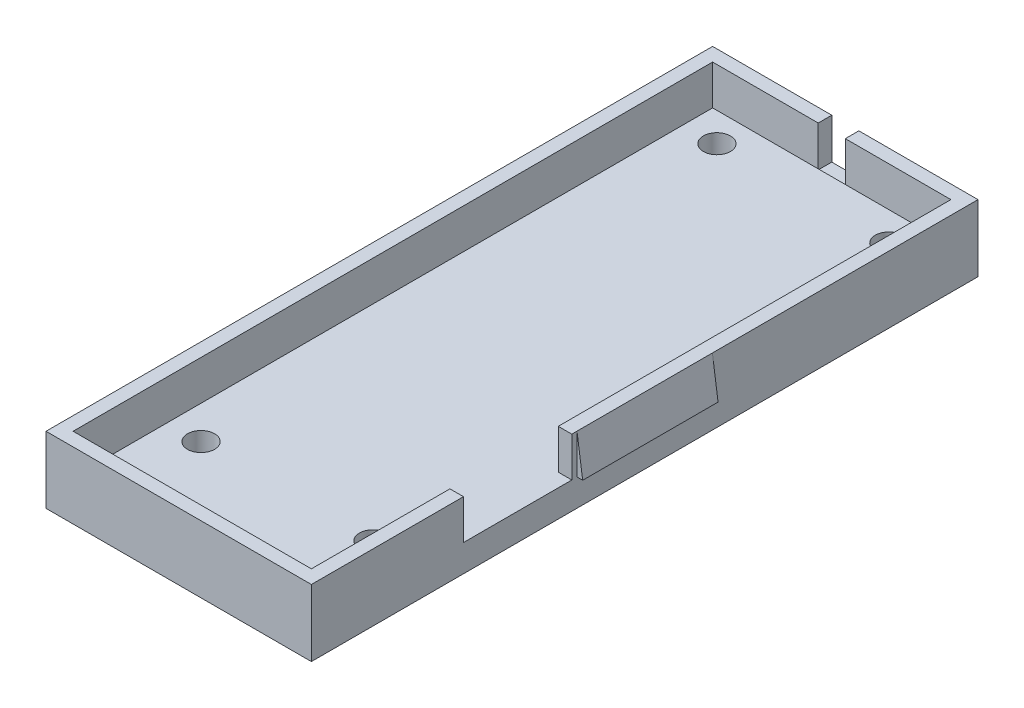
ISO-10303-21;
HEADER;
FILE_DESCRIPTION(('STEP AP214'),'2;1');
FILE_NAME('part.step','',(''),(''),'','','');
FILE_SCHEMA(('AUTOMOTIVE_DESIGN { 1 0 10303 214 1 1 1 1 }'));
ENDSEC;
DATA;
#1=APPLICATION_CONTEXT('core data for automotive mechanical design processes');
#2=APPLICATION_PROTOCOL_DEFINITION('international standard','automotive_design',2000,#1);
#3=PRODUCT_CONTEXT('',#1,'mechanical');
#4=PRODUCT('Part','Part','',(#3));
#5=PRODUCT_RELATED_PRODUCT_CATEGORY('part','',(#4));
#6=PRODUCT_DEFINITION_FORMATION('','',#4);
#7=PRODUCT_DEFINITION_CONTEXT('part definition',#1,'design');
#8=PRODUCT_DEFINITION('design','',#6,#7);
#9=PRODUCT_DEFINITION_SHAPE('','',#8);
#10=(LENGTH_UNIT() NAMED_UNIT(*) SI_UNIT(.MILLI.,.METRE.));
#11=(NAMED_UNIT(*) PLANE_ANGLE_UNIT() SI_UNIT($,.RADIAN.));
#12=(NAMED_UNIT(*) SI_UNIT($,.STERADIAN.) SOLID_ANGLE_UNIT());
#13=UNCERTAINTY_MEASURE_WITH_UNIT(LENGTH_MEASURE(1.E-05),#10,'distance_accuracy_value','');
#14=(GEOMETRIC_REPRESENTATION_CONTEXT(3) GLOBAL_UNCERTAINTY_ASSIGNED_CONTEXT((#13)) GLOBAL_UNIT_ASSIGNED_CONTEXT((#10,
#11,#12)) REPRESENTATION_CONTEXT('',''));
#15=CARTESIAN_POINT('',(0.,0.,0.));
#16=DIRECTION('',(0.,0.,1.));
#17=DIRECTION('',(1.,0.,0.));
#18=AXIS2_PLACEMENT_3D('',#15,#16,#17);
#19=CARTESIAN_POINT('',(14.7,-3.,0.));
#20=DIRECTION('',(1.,0.,0.));
#21=DIRECTION('',(0.,0.,-1.));
#22=AXIS2_PLACEMENT_3D('',#19,#20,#21);
#23=PLANE('',#22);
#24=DIRECTION('',(0.,0.,-1.));
#25=VECTOR('',#24,1.);
#26=CARTESIAN_POINT('',(14.7,4.4,0.));
#27=LINE('',#26,#25);
#28=CARTESIAN_POINT('',(14.7,4.4,-7.5));
#29=VERTEX_POINT('',#28);
#30=CARTESIAN_POINT('',(14.7,4.4,-36.925));
#31=VERTEX_POINT('',#30);
#32=EDGE_CURVE('E211',#29,#31,#27,.T.);
#33=ORIENTED_EDGE('',*,*,#32,.F.);
#34=DIRECTION('',(0.,-1.,0.));
#35=VECTOR('',#34,1.);
#36=CARTESIAN_POINT('',(14.7,4.4,-7.5));
#37=LINE('',#36,#35);
#38=CARTESIAN_POINT('',(14.7,0.,-7.5));
#39=VERTEX_POINT('',#38);
#40=EDGE_CURVE('E220',#29,#39,#37,.T.);
#41=ORIENTED_EDGE('',*,*,#40,.T.);
#42=DIRECTION('',(0.,0.,1.));
#43=VECTOR('',#42,1.);
#44=CARTESIAN_POINT('',(14.7,0.,-7.5));
#45=LINE('',#44,#43);
#46=CARTESIAN_POINT('',(14.7,0.,7.5));
#47=VERTEX_POINT('',#46);
#48=EDGE_CURVE('E667',#39,#47,#45,.T.);
#49=ORIENTED_EDGE('',*,*,#48,.T.);
#50=DIRECTION('',(0.,1.,0.));
#51=VECTOR('',#50,1.);
#52=CARTESIAN_POINT('',(14.7,4.4,7.5));
#53=LINE('',#52,#51);
#54=CARTESIAN_POINT('',(14.7,4.4,7.5));
#55=VERTEX_POINT('',#54);
#56=EDGE_CURVE('E227',#47,#55,#53,.T.);
#57=ORIENTED_EDGE('',*,*,#56,.T.);
#58=CARTESIAN_POINT('',(14.7,4.4,8.07500000000001));
#59=VERTEX_POINT('',#58);
#60=EDGE_CURVE('E215',#59,#55,#27,.T.);
#61=ORIENTED_EDGE('',*,*,#60,.F.);
#62=DIRECTION('',(0.,-1.,0.));
#63=VECTOR('',#62,1.);
#64=CARTESIAN_POINT('',(14.7,0.,8.07500000000001));
#65=LINE('',#64,#63);
#66=CARTESIAN_POINT('',(14.7,0.,8.07500000000001));
#67=VERTEX_POINT('',#66);
#68=EDGE_CURVE('E418',#59,#67,#65,.T.);
#69=ORIENTED_EDGE('',*,*,#68,.T.);
#70=DIRECTION('',(0.,0.,1.));
#71=VECTOR('',#70,1.);
#72=CARTESIAN_POINT('',(14.7,0.,8.07500000000001));
#73=LINE('',#72,#71);
#74=CARTESIAN_POINT('',(14.7,0.,20.075));
#75=VERTEX_POINT('',#74);
#76=EDGE_CURVE('E411',#67,#75,#73,.T.);
#77=ORIENTED_EDGE('',*,*,#76,.T.);
#78=DIRECTION('',(0.,1.,0.));
#79=VECTOR('',#78,1.);
#80=CARTESIAN_POINT('',(14.7,0.,20.075));
#81=LINE('',#80,#79);
#82=CARTESIAN_POINT('',(14.7,4.4,20.075));
#83=VERTEX_POINT('',#82);
#84=EDGE_CURVE('E424',#75,#83,#81,.T.);
#85=ORIENTED_EDGE('',*,*,#84,.T.);
#86=CARTESIAN_POINT('',(14.7,4.4,36.925));
#87=VERTEX_POINT('',#86);
#88=EDGE_CURVE('E235',#87,#83,#27,.T.);
#89=ORIENTED_EDGE('',*,*,#88,.F.);
#90=DIRECTION('',(0.,1.,0.));
#91=VECTOR('',#90,1.);
#92=CARTESIAN_POINT('',(14.7,-3.,36.925));
#93=LINE('',#92,#91);
#94=CARTESIAN_POINT('',(14.7,-3.,36.925));
#95=VERTEX_POINT('',#94);
#96=EDGE_CURVE('E329',#95,#87,#93,.T.);
#97=ORIENTED_EDGE('',*,*,#96,.F.);
#98=DIRECTION('',(0.,0.,-1.));
#99=VECTOR('',#98,1.);
#100=CARTESIAN_POINT('',(14.7,-3.,0.));
#101=LINE('',#100,#99);
#102=CARTESIAN_POINT('',(14.7,-3.,-36.925));
#103=VERTEX_POINT('',#102);
#104=EDGE_CURVE('E319',#95,#103,#101,.T.);
#105=ORIENTED_EDGE('',*,*,#104,.T.);
#106=DIRECTION('',(0.,1.,0.));
#107=VECTOR('',#106,1.);
#108=CARTESIAN_POINT('',(14.7,-3.,-36.925));
#109=LINE('',#108,#107);
#110=EDGE_CURVE('E230',#103,#31,#109,.T.);
#111=ORIENTED_EDGE('',*,*,#110,.T.);
#112=EDGE_LOOP('',(#33,#41,#49,#57,#61,#69,#77,#85,#89,#97,#105,#111));
#113=FACE_BOUND('',#112,.T.);
#114=ADVANCED_FACE('F47',(#113),#23,.T.);
#115=CARTESIAN_POINT('',(-14.7,-3.,0.));
#116=DIRECTION('',(1.,0.,0.));
#117=DIRECTION('',(0.,0.,-1.));
#118=AXIS2_PLACEMENT_3D('',#115,#116,#117);
#119=PLANE('',#118);
#120=DIRECTION('',(0.,-1.,0.));
#121=VECTOR('',#120,1.);
#122=CARTESIAN_POINT('',(-14.7,4.4,-7.5));
#123=LINE('',#122,#121);
#124=CARTESIAN_POINT('',(-14.7,4.4,-7.5));
#125=VERTEX_POINT('',#124);
#126=CARTESIAN_POINT('',(-14.7,0.,-7.5));
#127=VERTEX_POINT('',#126);
#128=EDGE_CURVE('E378',#125,#127,#123,.T.);
#129=ORIENTED_EDGE('',*,*,#128,.F.);
#130=DIRECTION('',(0.,0.,-1.));
#131=VECTOR('',#130,1.);
#132=CARTESIAN_POINT('',(-14.7,4.4,0.));
#133=LINE('',#132,#131);
#134=CARTESIAN_POINT('',(-14.7,4.4,-36.925));
#135=VERTEX_POINT('',#134);
#136=EDGE_CURVE('E257',#125,#135,#133,.T.);
#137=ORIENTED_EDGE('',*,*,#136,.T.);
#138=DIRECTION('',(0.,1.,0.));
#139=VECTOR('',#138,1.);
#140=CARTESIAN_POINT('',(-14.7,-3.,-36.925));
#141=LINE('',#140,#139);
#142=CARTESIAN_POINT('',(-14.7,-3.,-36.925));
#143=VERTEX_POINT('',#142);
#144=EDGE_CURVE('E334',#143,#135,#141,.T.);
#145=ORIENTED_EDGE('',*,*,#144,.F.);
#146=DIRECTION('',(0.,0.,-1.));
#147=VECTOR('',#146,1.);
#148=CARTESIAN_POINT('',(-14.7,-3.,0.));
#149=LINE('',#148,#147);
#150=CARTESIAN_POINT('',(-14.7,-3.,36.925));
#151=VERTEX_POINT('',#150);
#152=EDGE_CURVE('E326',#151,#143,#149,.T.);
#153=ORIENTED_EDGE('',*,*,#152,.F.);
#154=DIRECTION('',(0.,1.,0.));
#155=VECTOR('',#154,1.);
#156=CARTESIAN_POINT('',(-14.7,-3.,36.925));
#157=LINE('',#156,#155);
#158=CARTESIAN_POINT('',(-14.7,4.4,36.925));
#159=VERTEX_POINT('',#158);
#160=EDGE_CURVE('E330',#151,#159,#157,.T.);
#161=ORIENTED_EDGE('',*,*,#160,.T.);
#162=CARTESIAN_POINT('',(-14.7,4.4,7.5));
#163=VERTEX_POINT('',#162);
#164=EDGE_CURVE('E259',#159,#163,#133,.T.);
#165=ORIENTED_EDGE('',*,*,#164,.T.);
#166=DIRECTION('',(0.,1.,0.));
#167=VECTOR('',#166,1.);
#168=CARTESIAN_POINT('',(-14.7,4.4,7.5));
#169=LINE('',#168,#167);
#170=CARTESIAN_POINT('',(-14.7,0.,7.5));
#171=VERTEX_POINT('',#170);
#172=EDGE_CURVE('E392',#171,#163,#169,.T.);
#173=ORIENTED_EDGE('',*,*,#172,.F.);
#174=DIRECTION('',(0.,0.,1.));
#175=VECTOR('',#174,1.);
#176=CARTESIAN_POINT('',(-14.7,0.,-7.5));
#177=LINE('',#176,#175);
#178=EDGE_CURVE('E397',#127,#171,#177,.T.);
#179=ORIENTED_EDGE('',*,*,#178,.F.);
#180=EDGE_LOOP('',(#129,#137,#145,#153,#161,#165,#173,#179));
#181=FACE_BOUND('',#180,.T.);
#182=ADVANCED_FACE('F375',(#181),#119,.F.);
#183=CARTESIAN_POINT('',(13.2,4.4,0.));
#184=DIRECTION('',(-1.,0.,0.));
#185=DIRECTION('',(0.,0.,1.));
#186=AXIS2_PLACEMENT_3D('',#183,#184,#185);
#187=PLANE('',#186);
#188=DIRECTION('',(0.,1.,0.));
#189=VECTOR('',#188,1.);
#190=CARTESIAN_POINT('',(13.2,0.,20.075));
#191=LINE('',#190,#189);
#192=CARTESIAN_POINT('',(13.2,0.,20.075));
#193=VERTEX_POINT('',#192);
#194=CARTESIAN_POINT('',(13.2,4.4,20.075));
#195=VERTEX_POINT('',#194);
#196=EDGE_CURVE('E408',#193,#195,#191,.T.);
#197=ORIENTED_EDGE('',*,*,#196,.F.);
#198=DIRECTION('',(0.,0.,-1.));
#199=VECTOR('',#198,1.);
#200=CARTESIAN_POINT('',(13.2,0.,0.));
#201=LINE('',#200,#199);
#202=CARTESIAN_POINT('',(13.2,0.,35.425));
#203=VERTEX_POINT('',#202);
#204=EDGE_CURVE('E282',#203,#193,#201,.T.);
#205=ORIENTED_EDGE('',*,*,#204,.F.);
#206=DIRECTION('',(0.,-1.,0.));
#207=VECTOR('',#206,1.);
#208=CARTESIAN_POINT('',(13.2,4.4,35.425));
#209=LINE('',#208,#207);
#210=CARTESIAN_POINT('',(13.2,4.4,35.425));
#211=VERTEX_POINT('',#210);
#212=EDGE_CURVE('E311',#211,#203,#209,.T.);
#213=ORIENTED_EDGE('',*,*,#212,.F.);
#214=DIRECTION('',(0.,0.,-1.));
#215=VECTOR('',#214,1.);
#216=CARTESIAN_POINT('',(13.2,4.4,0.));
#217=LINE('',#216,#215);
#218=EDGE_CURVE('E264',#211,#195,#217,.T.);
#219=ORIENTED_EDGE('',*,*,#218,.T.);
#220=EDGE_LOOP('',(#197,#205,#213,#219));
#221=FACE_BOUND('',#220,.T.);
#222=ADVANCED_FACE('F518',(#221),#187,.T.);
#223=CARTESIAN_POINT('',(0.,4.4,0.));
#224=DIRECTION('',(0.,1.,0.));
#225=DIRECTION('',(0.,0.,1.));
#226=AXIS2_PLACEMENT_3D('',#223,#224,#225);
#227=PLANE('',#226);
#228=ORIENTED_EDGE('',*,*,#136,.F.);
#229=DIRECTION('',(0.,0.,1.));
#230=VECTOR('',#229,1.);
#231=CARTESIAN_POINT('',(-14.6999999999999,4.4,0.));
#232=LINE('',#231,#230);
#233=EDGE_CURVE('E363',#125,#163,#232,.T.);
#234=ORIENTED_EDGE('',*,*,#233,.T.);
#235=ORIENTED_EDGE('',*,*,#164,.F.);
#236=DIRECTION('',(-1.,0.,0.));
#237=VECTOR('',#236,1.);
#238=CARTESIAN_POINT('',(0.,4.4,36.925));
#239=LINE('',#238,#237);
#240=EDGE_CURVE('E233',#87,#159,#239,.T.);
#241=ORIENTED_EDGE('',*,*,#240,.F.);
#242=ORIENTED_EDGE('',*,*,#88,.T.);
#243=DIRECTION('',(-1.,0.,0.));
#244=VECTOR('',#243,1.);
#245=CARTESIAN_POINT('',(27.4812362469364,4.4,20.075));
#246=LINE('',#245,#244);
#247=EDGE_CURVE('E428',#83,#195,#246,.T.);
#248=ORIENTED_EDGE('',*,*,#247,.T.);
#249=ORIENTED_EDGE('',*,*,#218,.F.);
#250=DIRECTION('',(-1.,0.,0.));
#251=VECTOR('',#250,1.);
#252=CARTESIAN_POINT('',(0.,4.4,35.425));
#253=LINE('',#252,#251);
#254=CARTESIAN_POINT('',(-13.2,4.4,35.425));
#255=VERTEX_POINT('',#254);
#256=EDGE_CURVE('E268',#211,#255,#253,.T.);
#257=ORIENTED_EDGE('',*,*,#256,.T.);
#258=DIRECTION('',(0.,0.,-1.));
#259=VECTOR('',#258,1.);
#260=CARTESIAN_POINT('',(-13.2,4.4,0.));
#261=LINE('',#260,#259);
#262=CARTESIAN_POINT('',(-13.2,4.4,-35.425));
#263=VERTEX_POINT('',#262);
#264=EDGE_CURVE('E272',#255,#263,#261,.T.);
#265=ORIENTED_EDGE('',*,*,#264,.T.);
#266=DIRECTION('',(-1.,0.,0.));
#267=VECTOR('',#266,1.);
#268=CARTESIAN_POINT('',(0.,4.4,-35.425));
#269=LINE('',#268,#267);
#270=CARTESIAN_POINT('',(-1.5,4.4,-35.425));
#271=VERTEX_POINT('',#270);
#272=EDGE_CURVE('E276',#271,#263,#269,.T.);
#273=ORIENTED_EDGE('',*,*,#272,.F.);
#274=DIRECTION('',(0.,0.,-1.));
#275=VECTOR('',#274,1.);
#276=CARTESIAN_POINT('',(-1.5,4.4,-30.016673086804));
#277=LINE('',#276,#275);
#278=CARTESIAN_POINT('',(-1.5,4.4,-36.925));
#279=VERTEX_POINT('',#278);
#280=EDGE_CURVE('E463',#271,#279,#277,.T.);
#281=ORIENTED_EDGE('',*,*,#280,.T.);
#282=DIRECTION('',(-1.,0.,0.));
#283=VECTOR('',#282,1.);
#284=CARTESIAN_POINT('',(0.,4.4,-36.925));
#285=LINE('',#284,#283);
#286=EDGE_CURVE('E244',#279,#135,#285,.T.);
#287=ORIENTED_EDGE('',*,*,#286,.T.);
#288=EDGE_LOOP('',(#228,#234,#235,#241,#242,#248,#249,#257,#265,#273,#281,#287));
#289=FACE_BOUND('',#288,.T.);
#290=ADVANCED_FACE('F380',(#289),#227,.T.);
#291=CARTESIAN_POINT('',(0.,4.4,-35.425));
#292=DIRECTION('',(0.,0.,1.));
#293=DIRECTION('',(1.,0.,0.));
#294=AXIS2_PLACEMENT_3D('',#291,#292,#293);
#295=PLANE('',#294);
#296=DIRECTION('',(0.,1.,0.));
#297=VECTOR('',#296,1.);
#298=CARTESIAN_POINT('',(-1.5,4.4,-35.425));
#299=LINE('',#298,#297);
#300=CARTESIAN_POINT('',(-1.5,0.,-35.425));
#301=VERTEX_POINT('',#300);
#302=EDGE_CURVE('E464',#301,#271,#299,.T.);
#303=ORIENTED_EDGE('',*,*,#302,.T.);
#304=ORIENTED_EDGE('',*,*,#272,.T.);
#305=DIRECTION('',(0.,-1.,0.));
#306=VECTOR('',#305,1.);
#307=CARTESIAN_POINT('',(-13.2,4.4,-35.425));
#308=LINE('',#307,#306);
#309=CARTESIAN_POINT('',(-13.2,0.,-35.425));
#310=VERTEX_POINT('',#309);
#311=EDGE_CURVE('E303',#263,#310,#308,.T.);
#312=ORIENTED_EDGE('',*,*,#311,.T.);
#313=DIRECTION('',(-1.,0.,0.));
#314=VECTOR('',#313,1.);
#315=CARTESIAN_POINT('',(0.,0.,-35.425));
#316=LINE('',#315,#314);
#317=EDGE_CURVE('E295',#301,#310,#316,.T.);
#318=ORIENTED_EDGE('',*,*,#317,.F.);
#319=EDGE_LOOP('',(#303,#304,#312,#318));
#320=FACE_BOUND('',#319,.T.);
#321=ADVANCED_FACE('F525',(#320),#295,.T.);
#322=CARTESIAN_POINT('',(0.,-3.,36.925));
#323=DIRECTION('',(0.,0.,-1.));
#324=DIRECTION('',(-1.,0.,0.));
#325=AXIS2_PLACEMENT_3D('',#322,#323,#324);
#326=PLANE('',#325);
#327=ORIENTED_EDGE('',*,*,#96,.T.);
#328=ORIENTED_EDGE('',*,*,#240,.T.);
#329=ORIENTED_EDGE('',*,*,#160,.F.);
#330=DIRECTION('',(-1.,0.,0.));
#331=VECTOR('',#330,1.);
#332=CARTESIAN_POINT('',(0.,-3.,36.925));
#333=LINE('',#332,#331);
#334=EDGE_CURVE('E315',#95,#151,#333,.T.);
#335=ORIENTED_EDGE('',*,*,#334,.F.);
#336=EDGE_LOOP('',(#327,#328,#329,#335));
#337=FACE_BOUND('',#336,.T.);
#338=ADVANCED_FACE('F523',(#337),#326,.F.);
#339=CARTESIAN_POINT('',(0.,-3.,-36.925));
#340=DIRECTION('',(0.,0.,-1.));
#341=DIRECTION('',(-1.,0.,0.));
#342=AXIS2_PLACEMENT_3D('',#339,#340,#341);
#343=PLANE('',#342);
#344=DIRECTION('',(0.,1.,0.));
#345=VECTOR('',#344,1.);
#346=CARTESIAN_POINT('',(-1.5,4.4,-36.925));
#347=LINE('',#346,#345);
#348=CARTESIAN_POINT('',(-1.5,-0.0999999999999977,-36.925));
#349=VERTEX_POINT('',#348);
#350=EDGE_CURVE('E439',#349,#279,#347,.T.);
#351=ORIENTED_EDGE('',*,*,#350,.F.);
#352=DIRECTION('',(-1.,0.,0.));
#353=VECTOR('',#352,1.);
#354=CARTESIAN_POINT('',(-1.5,-0.0999999999999977,-36.925));
#355=LINE('',#354,#353);
#356=CARTESIAN_POINT('',(1.5,-0.0999999999999981,-36.925));
#357=VERTEX_POINT('',#356);
#358=EDGE_CURVE('E443',#357,#349,#355,.T.);
#359=ORIENTED_EDGE('',*,*,#358,.F.);
#360=DIRECTION('',(0.,-1.,0.));
#361=VECTOR('',#360,1.);
#362=CARTESIAN_POINT('',(1.5,4.4,-36.925));
#363=LINE('',#362,#361);
#364=CARTESIAN_POINT('',(1.5,4.4,-36.925));
#365=VERTEX_POINT('',#364);
#366=EDGE_CURVE('E438',#365,#357,#363,.T.);
#367=ORIENTED_EDGE('',*,*,#366,.F.);
#368=EDGE_CURVE('E251',#31,#365,#285,.T.);
#369=ORIENTED_EDGE('',*,*,#368,.F.);
#370=ORIENTED_EDGE('',*,*,#110,.F.);
#371=DIRECTION('',(-1.,0.,0.));
#372=VECTOR('',#371,1.);
#373=CARTESIAN_POINT('',(0.,-3.,-36.925));
#374=LINE('',#373,#372);
#375=EDGE_CURVE('E322',#103,#143,#374,.T.);
#376=ORIENTED_EDGE('',*,*,#375,.T.);
#377=ORIENTED_EDGE('',*,*,#144,.T.);
#378=ORIENTED_EDGE('',*,*,#286,.F.);
#379=EDGE_LOOP('',(#351,#359,#367,#369,#370,#376,#377,#378));
#380=FACE_BOUND('',#379,.T.);
#381=ADVANCED_FACE('F522',(#380),#343,.T.);
#382=CARTESIAN_POINT('',(0.,-3.,0.));
#383=DIRECTION('',(0.,1.,0.));
#384=DIRECTION('',(0.,0.,1.));
#385=AXIS2_PLACEMENT_3D('',#382,#383,#384);
#386=PLANE('',#385);
#387=CARTESIAN_POINT('',(9.52500000000001,-3.,24.925));
#388=DIRECTION('',(0.,1.,0.));
#389=DIRECTION('',(0.,0.,1.));
#390=AXIS2_PLACEMENT_3D('',#387,#388,#389);
#391=CIRCLE('',#390,1.5);
#392=CARTESIAN_POINT('',(9.52500000000001,-3.,26.425));
#393=VERTEX_POINT('',#392);
#394=EDGE_CURVE('E474',#393,#393,#391,.T.);
#395=ORIENTED_EDGE('',*,*,#394,.T.);
#396=EDGE_LOOP('',(#395));
#397=FACE_BOUND('',#396,.T.);
#398=CARTESIAN_POINT('',(-9.52499999999999,-3.,24.925));
#399=DIRECTION('',(0.,1.,0.));
#400=DIRECTION('',(0.,0.,1.));
#401=AXIS2_PLACEMENT_3D('',#398,#399,#400);
#402=CIRCLE('',#401,1.5);
#403=CARTESIAN_POINT('',(-9.52499999999999,-3.,26.425));
#404=VERTEX_POINT('',#403);
#405=EDGE_CURVE('E479',#404,#404,#402,.T.);
#406=ORIENTED_EDGE('',*,*,#405,.T.);
#407=EDGE_LOOP('',(#406));
#408=FACE_BOUND('',#407,.T.);
#409=CARTESIAN_POINT('',(-9.525,-3.,-32.225));
#410=DIRECTION('',(0.,1.,0.));
#411=DIRECTION('',(0.,0.,1.));
#412=AXIS2_PLACEMENT_3D('',#409,#410,#411);
#413=CIRCLE('',#412,1.5);
#414=CARTESIAN_POINT('',(-9.525,-3.,-30.725));
#415=VERTEX_POINT('',#414);
#416=EDGE_CURVE('E475',#415,#415,#413,.T.);
#417=ORIENTED_EDGE('',*,*,#416,.T.);
#418=EDGE_LOOP('',(#417));
#419=FACE_BOUND('',#418,.T.);
#420=CARTESIAN_POINT('',(9.525,-3.,-32.225));
#421=DIRECTION('',(0.,1.,0.));
#422=DIRECTION('',(0.,0.,1.));
#423=AXIS2_PLACEMENT_3D('',#420,#421,#422);
#424=CIRCLE('',#423,1.5);
#425=CARTESIAN_POINT('',(9.525,-3.,-30.725));
#426=VERTEX_POINT('',#425);
#427=EDGE_CURVE('E346',#426,#426,#424,.T.);
#428=ORIENTED_EDGE('',*,*,#427,.T.);
#429=EDGE_LOOP('',(#428));
#430=FACE_BOUND('',#429,.T.);
#431=ORIENTED_EDGE('',*,*,#334,.T.);
#432=ORIENTED_EDGE('',*,*,#152,.T.);
#433=ORIENTED_EDGE('',*,*,#375,.F.);
#434=ORIENTED_EDGE('',*,*,#104,.F.);
#435=EDGE_LOOP('',(#431,#432,#433,#434));
#436=FACE_BOUND('',#435,.T.);
#437=ADVANCED_FACE('F490',(#397,#408,#419,#430,#436),#386,.F.);
#438=DIRECTION('',(0.,-1.,0.));
#439=VECTOR('',#438,1.);
#440=CARTESIAN_POINT('',(13.2,0.,8.07500000000001));
#441=LINE('',#440,#439);
#442=CARTESIAN_POINT('',(13.2,4.4,8.07500000000001));
#443=VERTEX_POINT('',#442);
#444=CARTESIAN_POINT('',(13.2,0.,8.07500000000001));
#445=VERTEX_POINT('',#444);
#446=EDGE_CURVE('E403',#443,#445,#441,.T.);
#447=ORIENTED_EDGE('',*,*,#446,.F.);
#448=CARTESIAN_POINT('',(13.2,4.4,-35.425));
#449=VERTEX_POINT('',#448);
#450=EDGE_CURVE('E263',#443,#449,#217,.T.);
#451=ORIENTED_EDGE('',*,*,#450,.T.);
#452=DIRECTION('',(0.,-1.,0.));
#453=VECTOR('',#452,1.);
#454=CARTESIAN_POINT('',(13.2,4.4,-35.425));
#455=LINE('',#454,#453);
#456=CARTESIAN_POINT('',(13.2,0.,-35.425));
#457=VERTEX_POINT('',#456);
#458=EDGE_CURVE('E281',#449,#457,#455,.T.);
#459=ORIENTED_EDGE('',*,*,#458,.T.);
#460=EDGE_CURVE('E287',#445,#457,#201,.T.);
#461=ORIENTED_EDGE('',*,*,#460,.F.);
#462=EDGE_LOOP('',(#447,#451,#459,#461));
#463=FACE_BOUND('',#462,.T.);
#464=ADVANCED_FACE('F586',(#463),#187,.T.);
#465=CARTESIAN_POINT('',(0.,4.4,35.425));
#466=DIRECTION('',(0.,0.,1.));
#467=DIRECTION('',(1.,0.,0.));
#468=AXIS2_PLACEMENT_3D('',#465,#466,#467);
#469=PLANE('',#468);
#470=DIRECTION('',(-1.,0.,0.));
#471=VECTOR('',#470,1.);
#472=CARTESIAN_POINT('',(0.,0.,35.425));
#473=LINE('',#472,#471);
#474=CARTESIAN_POINT('',(-13.2,0.,35.425));
#475=VERTEX_POINT('',#474);
#476=EDGE_CURVE('E286',#203,#475,#473,.T.);
#477=ORIENTED_EDGE('',*,*,#476,.T.);
#478=DIRECTION('',(0.,-1.,0.));
#479=VECTOR('',#478,1.);
#480=CARTESIAN_POINT('',(-13.2,4.4,35.425));
#481=LINE('',#480,#479);
#482=EDGE_CURVE('E307',#255,#475,#481,.T.);
#483=ORIENTED_EDGE('',*,*,#482,.F.);
#484=ORIENTED_EDGE('',*,*,#256,.F.);
#485=ORIENTED_EDGE('',*,*,#212,.T.);
#486=EDGE_LOOP('',(#477,#483,#484,#485));
#487=FACE_BOUND('',#486,.T.);
#488=ADVANCED_FACE('F598',(#487),#469,.F.);
#489=CARTESIAN_POINT('',(-13.2,4.4,0.));
#490=DIRECTION('',(-1.,0.,0.));
#491=DIRECTION('',(0.,0.,1.));
#492=AXIS2_PLACEMENT_3D('',#489,#490,#491);
#493=PLANE('',#492);
#494=DIRECTION('',(0.,0.,-1.));
#495=VECTOR('',#494,1.);
#496=CARTESIAN_POINT('',(-13.2,0.,0.));
#497=LINE('',#496,#495);
#498=EDGE_CURVE('E291',#475,#310,#497,.T.);
#499=ORIENTED_EDGE('',*,*,#498,.T.);
#500=ORIENTED_EDGE('',*,*,#311,.F.);
#501=ORIENTED_EDGE('',*,*,#264,.F.);
#502=ORIENTED_EDGE('',*,*,#482,.T.);
#503=EDGE_LOOP('',(#499,#500,#501,#502));
#504=FACE_BOUND('',#503,.T.);
#505=ADVANCED_FACE('F606',(#504),#493,.F.);
#506=DIRECTION('',(0.,-1.,0.));
#507=VECTOR('',#506,1.);
#508=CARTESIAN_POINT('',(1.5,4.4,-35.425));
#509=LINE('',#508,#507);
#510=CARTESIAN_POINT('',(1.5,4.4,-35.425));
#511=VERTEX_POINT('',#510);
#512=CARTESIAN_POINT('',(1.5,0.,-35.425));
#513=VERTEX_POINT('',#512);
#514=EDGE_CURVE('E454',#511,#513,#509,.T.);
#515=ORIENTED_EDGE('',*,*,#514,.T.);
#516=EDGE_CURVE('E239',#457,#513,#316,.T.);
#517=ORIENTED_EDGE('',*,*,#516,.F.);
#518=ORIENTED_EDGE('',*,*,#458,.F.);
#519=EDGE_CURVE('E277',#449,#511,#269,.T.);
#520=ORIENTED_EDGE('',*,*,#519,.T.);
#521=EDGE_LOOP('',(#515,#517,#518,#520));
#522=FACE_BOUND('',#521,.T.);
#523=ADVANCED_FACE('F610',(#522),#295,.T.);
#524=ORIENTED_EDGE('',*,*,#60,.T.);
#525=DIRECTION('',(0.,0.,-1.));
#526=VECTOR('',#525,1.);
#527=CARTESIAN_POINT('',(14.6999999999999,4.4,0.));
#528=LINE('',#527,#526);
#529=EDGE_CURVE('E203',#55,#29,#528,.T.);
#530=ORIENTED_EDGE('',*,*,#529,.T.);
#531=ORIENTED_EDGE('',*,*,#32,.T.);
#532=ORIENTED_EDGE('',*,*,#368,.T.);
#533=DIRECTION('',(0.,0.,-1.));
#534=VECTOR('',#533,1.);
#535=CARTESIAN_POINT('',(1.5,4.4,-30.016673086804));
#536=LINE('',#535,#534);
#537=EDGE_CURVE('E465',#511,#365,#536,.T.);
#538=ORIENTED_EDGE('',*,*,#537,.F.);
#539=ORIENTED_EDGE('',*,*,#519,.F.);
#540=ORIENTED_EDGE('',*,*,#450,.F.);
#541=DIRECTION('',(-1.,0.,0.));
#542=VECTOR('',#541,1.);
#543=CARTESIAN_POINT('',(27.4812362469364,4.4,8.07500000000001));
#544=LINE('',#543,#542);
#545=EDGE_CURVE('E423',#59,#443,#544,.T.);
#546=ORIENTED_EDGE('',*,*,#545,.F.);
#547=EDGE_LOOP('',(#524,#530,#531,#532,#538,#539,#540,#546));
#548=FACE_BOUND('',#547,.T.);
#549=ADVANCED_FACE('F208',(#548),#227,.T.);
#550=CARTESIAN_POINT('',(0.,0.,0.));
#551=DIRECTION('',(0.,1.,0.));
#552=DIRECTION('',(0.,0.,1.));
#553=AXIS2_PLACEMENT_3D('',#550,#551,#552);
#554=PLANE('',#553);
#555=CARTESIAN_POINT('',(9.52500000000001,0.,24.925));
#556=DIRECTION('',(0.,1.,0.));
#557=DIRECTION('',(0.,0.,1.));
#558=AXIS2_PLACEMENT_3D('',#555,#556,#557);
#559=CIRCLE('',#558,1.5);
#560=CARTESIAN_POINT('',(9.52500000000001,0.,26.425));
#561=VERTEX_POINT('',#560);
#562=EDGE_CURVE('E354',#561,#561,#559,.T.);
#563=ORIENTED_EDGE('',*,*,#562,.F.);
#564=EDGE_LOOP('',(#563));
#565=FACE_BOUND('',#564,.T.);
#566=CARTESIAN_POINT('',(-9.52499999999999,0.,24.925));
#567=DIRECTION('',(0.,1.,0.));
#568=DIRECTION('',(0.,0.,1.));
#569=AXIS2_PLACEMENT_3D('',#566,#567,#568);
#570=CIRCLE('',#569,1.5);
#571=CARTESIAN_POINT('',(-9.52499999999999,0.,26.425));
#572=VERTEX_POINT('',#571);
#573=EDGE_CURVE('E350',#572,#572,#570,.T.);
#574=ORIENTED_EDGE('',*,*,#573,.F.);
#575=EDGE_LOOP('',(#574));
#576=FACE_BOUND('',#575,.T.);
#577=CARTESIAN_POINT('',(-9.525,0.,-32.225));
#578=DIRECTION('',(0.,1.,0.));
#579=DIRECTION('',(0.,0.,1.));
#580=AXIS2_PLACEMENT_3D('',#577,#578,#579);
#581=CIRCLE('',#580,1.5);
#582=CARTESIAN_POINT('',(-9.525,0.,-30.725));
#583=VERTEX_POINT('',#582);
#584=EDGE_CURVE('E345',#583,#583,#581,.T.);
#585=ORIENTED_EDGE('',*,*,#584,.F.);
#586=EDGE_LOOP('',(#585));
#587=FACE_BOUND('',#586,.T.);
#588=CARTESIAN_POINT('',(9.525,0.,-32.225));
#589=DIRECTION('',(0.,1.,0.));
#590=DIRECTION('',(0.,0.,1.));
#591=AXIS2_PLACEMENT_3D('',#588,#589,#590);
#592=CIRCLE('',#591,1.5);
#593=CARTESIAN_POINT('',(9.525,0.,-30.725));
#594=VERTEX_POINT('',#593);
#595=EDGE_CURVE('E341',#594,#594,#592,.T.);
#596=ORIENTED_EDGE('',*,*,#595,.F.);
#597=EDGE_LOOP('',(#596));
#598=FACE_BOUND('',#597,.T.);
#599=ORIENTED_EDGE('',*,*,#204,.T.);
#600=DIRECTION('',(-1.,0.,0.));
#601=VECTOR('',#600,1.);
#602=CARTESIAN_POINT('',(27.4812362469364,0.,20.075));
#603=LINE('',#602,#601);
#604=EDGE_CURVE('E417',#75,#193,#603,.T.);
#605=ORIENTED_EDGE('',*,*,#604,.F.);
#606=ORIENTED_EDGE('',*,*,#76,.F.);
#607=DIRECTION('',(-1.,0.,0.));
#608=VECTOR('',#607,1.);
#609=CARTESIAN_POINT('',(27.4812362469364,0.,8.07500000000001));
#610=LINE('',#609,#608);
#611=EDGE_CURVE('E422',#67,#445,#610,.T.);
#612=ORIENTED_EDGE('',*,*,#611,.T.);
#613=ORIENTED_EDGE('',*,*,#460,.T.);
#614=ORIENTED_EDGE('',*,*,#516,.T.);
#615=EDGE_CURVE('E299',#513,#301,#316,.T.);
#616=ORIENTED_EDGE('',*,*,#615,.T.);
#617=ORIENTED_EDGE('',*,*,#317,.T.);
#618=ORIENTED_EDGE('',*,*,#498,.F.);
#619=ORIENTED_EDGE('',*,*,#476,.F.);
#620=EDGE_LOOP('',(#599,#605,#606,#612,#613,#614,#616,#617,#618,#619));
#621=FACE_BOUND('',#620,.T.);
#622=ADVANCED_FACE('F496',(#565,#576,#587,#598,#621),#554,.T.);
#623=CARTESIAN_POINT('',(9.525,-3.,-32.225));
#624=DIRECTION('',(0.,1.,0.));
#625=DIRECTION('',(0.,0.,1.));
#626=AXIS2_PLACEMENT_3D('',#623,#624,#625);
#627=CYLINDRICAL_SURFACE('',#626,1.5);
#628=ORIENTED_EDGE('',*,*,#595,.T.);
#629=EDGE_LOOP('',(#628));
#630=FACE_BOUND('',#629,.T.);
#631=ORIENTED_EDGE('',*,*,#427,.F.);
#632=EDGE_LOOP('',(#631));
#633=FACE_BOUND('',#632,.T.);
#634=ADVANCED_FACE('F493',(#630,#633),#627,.F.);
#635=CARTESIAN_POINT('',(-9.525,-3.,-32.225));
#636=DIRECTION('',(0.,1.,0.));
#637=DIRECTION('',(0.,0.,1.));
#638=AXIS2_PLACEMENT_3D('',#635,#636,#637);
#639=CYLINDRICAL_SURFACE('',#638,1.5);
#640=ORIENTED_EDGE('',*,*,#584,.T.);
#641=EDGE_LOOP('',(#640));
#642=FACE_BOUND('',#641,.T.);
#643=ORIENTED_EDGE('',*,*,#416,.F.);
#644=EDGE_LOOP('',(#643));
#645=FACE_BOUND('',#644,.T.);
#646=ADVANCED_FACE('F495',(#642,#645),#639,.F.);
#647=CARTESIAN_POINT('',(-9.52499999999999,-3.,24.925));
#648=DIRECTION('',(0.,1.,0.));
#649=DIRECTION('',(0.,0.,1.));
#650=AXIS2_PLACEMENT_3D('',#647,#648,#649);
#651=CYLINDRICAL_SURFACE('',#650,1.5);
#652=ORIENTED_EDGE('',*,*,#573,.T.);
#653=EDGE_LOOP('',(#652));
#654=FACE_BOUND('',#653,.T.);
#655=ORIENTED_EDGE('',*,*,#405,.F.);
#656=EDGE_LOOP('',(#655));
#657=FACE_BOUND('',#656,.T.);
#658=ADVANCED_FACE('F503',(#654,#657),#651,.F.);
#659=CARTESIAN_POINT('',(9.52500000000001,-3.,24.925));
#660=DIRECTION('',(0.,1.,0.));
#661=DIRECTION('',(0.,0.,1.));
#662=AXIS2_PLACEMENT_3D('',#659,#660,#661);
#663=CYLINDRICAL_SURFACE('',#662,1.5);
#664=ORIENTED_EDGE('',*,*,#562,.T.);
#665=EDGE_LOOP('',(#664));
#666=FACE_BOUND('',#665,.T.);
#667=ORIENTED_EDGE('',*,*,#394,.F.);
#668=EDGE_LOOP('',(#667));
#669=FACE_BOUND('',#668,.T.);
#670=ADVANCED_FACE('F570',(#666,#669),#663,.F.);
#671=CARTESIAN_POINT('',(0.,4.4,-35.425));
#672=DIRECTION('',(0.,0.,1.));
#673=DIRECTION('',(1.,0.,0.));
#674=AXIS2_PLACEMENT_3D('',#671,#672,#673);
#675=PLANE('',#674);
#676=ORIENTED_EDGE('',*,*,#615,.F.);
#677=CARTESIAN_POINT('',(1.5,-0.0999999999999981,-35.425));
#678=VERTEX_POINT('',#677);
#679=EDGE_CURVE('E459',#513,#678,#509,.T.);
#680=ORIENTED_EDGE('',*,*,#679,.T.);
#681=DIRECTION('',(-1.,0.,0.));
#682=VECTOR('',#681,1.);
#683=CARTESIAN_POINT('',(-1.5,-0.0999999999999977,-35.425));
#684=LINE('',#683,#682);
#685=CARTESIAN_POINT('',(-1.5,-0.0999999999999977,-35.425));
#686=VERTEX_POINT('',#685);
#687=EDGE_CURVE('E442',#678,#686,#684,.T.);
#688=ORIENTED_EDGE('',*,*,#687,.T.);
#689=EDGE_CURVE('E460',#686,#301,#299,.T.);
#690=ORIENTED_EDGE('',*,*,#689,.T.);
#691=EDGE_LOOP('',(#676,#680,#688,#690));
#692=FACE_BOUND('',#691,.T.);
#693=ADVANCED_FACE('F567',(#692),#675,.F.);
#694=CARTESIAN_POINT('',(-1.5,-0.0999999999999977,-30.016673086804));
#695=DIRECTION('',(0.,-1.,0.));
#696=DIRECTION('',(1.,0.,0.));
#697=AXIS2_PLACEMENT_3D('',#694,#695,#696);
#698=PLANE('',#697);
#699=DIRECTION('',(0.,0.,-1.));
#700=VECTOR('',#699,1.);
#701=CARTESIAN_POINT('',(1.5,-0.0999999999999981,-30.016673086804));
#702=LINE('',#701,#700);
#703=EDGE_CURVE('E458',#678,#357,#702,.T.);
#704=ORIENTED_EDGE('',*,*,#703,.T.);
#705=ORIENTED_EDGE('',*,*,#358,.T.);
#706=DIRECTION('',(0.,0.,-1.));
#707=VECTOR('',#706,1.);
#708=CARTESIAN_POINT('',(-1.5,-0.0999999999999977,-30.016673086804));
#709=LINE('',#708,#707);
#710=EDGE_CURVE('E453',#686,#349,#709,.T.);
#711=ORIENTED_EDGE('',*,*,#710,.F.);
#712=ORIENTED_EDGE('',*,*,#687,.F.);
#713=EDGE_LOOP('',(#704,#705,#711,#712));
#714=FACE_BOUND('',#713,.T.);
#715=ADVANCED_FACE('F563',(#714),#698,.F.);
#716=CARTESIAN_POINT('',(-1.5,4.4,-30.016673086804));
#717=DIRECTION('',(-1.,0.,0.));
#718=DIRECTION('',(0.,-1.,0.));
#719=AXIS2_PLACEMENT_3D('',#716,#717,#718);
#720=PLANE('',#719);
#721=ORIENTED_EDGE('',*,*,#710,.T.);
#722=ORIENTED_EDGE('',*,*,#350,.T.);
#723=ORIENTED_EDGE('',*,*,#280,.F.);
#724=ORIENTED_EDGE('',*,*,#302,.F.);
#725=ORIENTED_EDGE('',*,*,#689,.F.);
#726=EDGE_LOOP('',(#721,#722,#723,#724,#725));
#727=FACE_BOUND('',#726,.T.);
#728=ADVANCED_FACE('F559',(#727),#720,.F.);
#729=CARTESIAN_POINT('',(1.5,4.4,-30.016673086804));
#730=DIRECTION('',(1.,0.,0.));
#731=DIRECTION('',(0.,1.,0.));
#732=AXIS2_PLACEMENT_3D('',#729,#730,#731);
#733=PLANE('',#732);
#734=ORIENTED_EDGE('',*,*,#537,.T.);
#735=ORIENTED_EDGE('',*,*,#366,.T.);
#736=ORIENTED_EDGE('',*,*,#703,.F.);
#737=ORIENTED_EDGE('',*,*,#679,.F.);
#738=ORIENTED_EDGE('',*,*,#514,.F.);
#739=EDGE_LOOP('',(#734,#735,#736,#737,#738));
#740=FACE_BOUND('',#739,.T.);
#741=ADVANCED_FACE('F555',(#740),#733,.F.);
#742=CARTESIAN_POINT('',(27.4812362469364,0.,20.075));
#743=DIRECTION('',(0.,0.,1.));
#744=DIRECTION('',(1.,0.,0.));
#745=AXIS2_PLACEMENT_3D('',#742,#743,#744);
#746=PLANE('',#745);
#747=ORIENTED_EDGE('',*,*,#604,.T.);
#748=ORIENTED_EDGE('',*,*,#196,.T.);
#749=ORIENTED_EDGE('',*,*,#247,.F.);
#750=ORIENTED_EDGE('',*,*,#84,.F.);
#751=EDGE_LOOP('',(#747,#748,#749,#750));
#752=FACE_BOUND('',#751,.T.);
#753=ADVANCED_FACE('F551',(#752),#746,.F.);
#754=CARTESIAN_POINT('',(27.4812362469364,0.,8.07500000000001));
#755=DIRECTION('',(0.,0.,-1.));
#756=DIRECTION('',(-1.,0.,0.));
#757=AXIS2_PLACEMENT_3D('',#754,#755,#756);
#758=PLANE('',#757);
#759=ORIENTED_EDGE('',*,*,#545,.T.);
#760=ORIENTED_EDGE('',*,*,#446,.T.);
#761=ORIENTED_EDGE('',*,*,#611,.F.);
#762=ORIENTED_EDGE('',*,*,#68,.F.);
#763=EDGE_LOOP('',(#759,#760,#761,#762));
#764=FACE_BOUND('',#763,.T.);
#765=ADVANCED_FACE('F547',(#764),#758,.F.);
#766=CARTESIAN_POINT('',(-15.7,4.4,-7.5));
#767=DIRECTION('',(0.,0.,1.));
#768=DIRECTION('',(0.,-1.,0.));
#769=AXIS2_PLACEMENT_3D('',#766,#767,#768);
#770=PLANE('',#769);
#771=DIRECTION('',(1.,0.,0.));
#772=VECTOR('',#771,1.);
#773=CARTESIAN_POINT('',(-15.7,0.,-7.5));
#774=LINE('',#773,#772);
#775=CARTESIAN_POINT('',(-15.3285714285714,0.,-7.5));
#776=VERTEX_POINT('',#775);
#777=EDGE_CURVE('E399',#776,#127,#774,.T.);
#778=ORIENTED_EDGE('',*,*,#777,.F.);
#779=DIRECTION('',(-0.141421356237316,-0.989949493661166,0.));
#780=VECTOR('',#779,1.);
#781=CARTESIAN_POINT('',(-15.7,-2.60000000000001,-7.5));
#782=LINE('',#781,#780);
#783=EDGE_CURVE('E360',#776,#125,#782,.F.);
#784=ORIENTED_EDGE('',*,*,#783,.T.);
#785=ORIENTED_EDGE('',*,*,#128,.T.);
#786=EDGE_LOOP('',(#778,#784,#785));
#787=FACE_BOUND('',#786,.T.);
#788=ADVANCED_FACE('F541',(#787),#770,.F.);
#789=CARTESIAN_POINT('',(-15.7,0.,-7.5));
#790=DIRECTION('',(0.,1.,0.));
#791=DIRECTION('',(0.,0.,1.));
#792=AXIS2_PLACEMENT_3D('',#789,#790,#791);
#793=PLANE('',#792);
#794=DIRECTION('',(1.,0.,0.));
#795=VECTOR('',#794,1.);
#796=CARTESIAN_POINT('',(-15.7,0.,7.5));
#797=LINE('',#796,#795);
#798=CARTESIAN_POINT('',(-15.3285714285714,0.,7.5));
#799=VERTEX_POINT('',#798);
#800=EDGE_CURVE('E390',#799,#171,#797,.T.);
#801=ORIENTED_EDGE('',*,*,#800,.F.);
#802=DIRECTION('',(0.,0.,1.));
#803=VECTOR('',#802,1.);
#804=CARTESIAN_POINT('',(-15.3285714285714,0.,0.));
#805=LINE('',#804,#803);
#806=EDGE_CURVE('E333',#799,#776,#805,.F.);
#807=ORIENTED_EDGE('',*,*,#806,.T.);
#808=ORIENTED_EDGE('',*,*,#777,.T.);
#809=ORIENTED_EDGE('',*,*,#178,.T.);
#810=EDGE_LOOP('',(#801,#807,#808,#809));
#811=FACE_BOUND('',#810,.T.);
#812=ADVANCED_FACE('F395',(#811),#793,.F.);
#813=CARTESIAN_POINT('',(-15.7,4.4,7.5));
#814=DIRECTION('',(0.,0.,-1.));
#815=DIRECTION('',(0.,1.,0.));
#816=AXIS2_PLACEMENT_3D('',#813,#814,#815);
#817=PLANE('',#816);
#818=ORIENTED_EDGE('',*,*,#172,.T.);
#819=DIRECTION('',(0.141421356237316,0.989949493661166,0.));
#820=VECTOR('',#819,1.);
#821=CARTESIAN_POINT('',(-15.7,-2.6,7.5));
#822=LINE('',#821,#820);
#823=EDGE_CURVE('E217',#163,#799,#822,.F.);
#824=ORIENTED_EDGE('',*,*,#823,.T.);
#825=ORIENTED_EDGE('',*,*,#800,.T.);
#826=EDGE_LOOP('',(#818,#824,#825));
#827=FACE_BOUND('',#826,.T.);
#828=ADVANCED_FACE('F389',(#827),#817,.F.);
#829=CARTESIAN_POINT('',(-15.7,-2.60000000000001,0.));
#830=DIRECTION('',(0.989949493661166,-0.141421356237316,0.));
#831=DIRECTION('',(0.,0.,-1.));
#832=AXIS2_PLACEMENT_3D('',#829,#830,#831);
#833=PLANE('',#832);
#834=ORIENTED_EDGE('',*,*,#823,.F.);
#835=ORIENTED_EDGE('',*,*,#233,.F.);
#836=ORIENTED_EDGE('',*,*,#783,.F.);
#837=ORIENTED_EDGE('',*,*,#806,.F.);
#838=EDGE_LOOP('',(#834,#835,#836,#837));
#839=FACE_BOUND('',#838,.T.);
#840=ADVANCED_FACE('F384',(#839),#833,.F.);
#841=CARTESIAN_POINT('',(15.7,4.4,-7.5));
#842=DIRECTION('',(0.,0.,-1.));
#843=DIRECTION('',(0.,1.,0.));
#844=AXIS2_PLACEMENT_3D('',#841,#842,#843);
#845=PLANE('',#844);
#846=ORIENTED_EDGE('',*,*,#40,.F.);
#847=DIRECTION('',(-0.141421356237316,0.989949493661166,0.));
#848=VECTOR('',#847,1.);
#849=CARTESIAN_POINT('',(14.7199999999999,4.25999999999999,-7.5));
#850=LINE('',#849,#848);
#851=CARTESIAN_POINT('',(15.3285714285714,0.,-7.5));
#852=VERTEX_POINT('',#851);
#853=EDGE_CURVE('E71',#29,#852,#850,.F.);
#854=ORIENTED_EDGE('',*,*,#853,.T.);
#855=DIRECTION('',(-1.,0.,0.));
#856=VECTOR('',#855,1.);
#857=CARTESIAN_POINT('',(15.7,0.,-7.5));
#858=LINE('',#857,#856);
#859=EDGE_CURVE('E222',#852,#39,#858,.T.);
#860=ORIENTED_EDGE('',*,*,#859,.T.);
#861=EDGE_LOOP('',(#846,#854,#860));
#862=FACE_BOUND('',#861,.T.);
#863=ADVANCED_FACE('F221',(#862),#845,.T.);
#864=CARTESIAN_POINT('',(15.7,4.4,7.5));
#865=DIRECTION('',(0.,0.,1.));
#866=DIRECTION('',(0.,-1.,0.));
#867=AXIS2_PLACEMENT_3D('',#864,#865,#866);
#868=PLANE('',#867);
#869=DIRECTION('',(-1.,0.,0.));
#870=VECTOR('',#869,1.);
#871=CARTESIAN_POINT('',(15.7,0.,7.5));
#872=LINE('',#871,#870);
#873=CARTESIAN_POINT('',(15.3285714285714,0.,7.5));
#874=VERTEX_POINT('',#873);
#875=EDGE_CURVE('E660',#874,#47,#872,.T.);
#876=ORIENTED_EDGE('',*,*,#875,.F.);
#877=DIRECTION('',(0.141421356237316,-0.989949493661166,0.));
#878=VECTOR('',#877,1.);
#879=CARTESIAN_POINT('',(14.7199999999999,4.25999999999999,7.5));
#880=LINE('',#879,#878);
#881=EDGE_CURVE('E11',#874,#55,#880,.F.);
#882=ORIENTED_EDGE('',*,*,#881,.T.);
#883=ORIENTED_EDGE('',*,*,#56,.F.);
#884=EDGE_LOOP('',(#876,#882,#883));
#885=FACE_BOUND('',#884,.T.);
#886=ADVANCED_FACE('F535',(#885),#868,.T.);
#887=CARTESIAN_POINT('',(15.7,0.,-7.5));
#888=DIRECTION('',(0.,-1.,0.));
#889=DIRECTION('',(0.,0.,-1.));
#890=AXIS2_PLACEMENT_3D('',#887,#888,#889);
#891=PLANE('',#890);
#892=ORIENTED_EDGE('',*,*,#859,.F.);
#893=DIRECTION('',(0.,0.,-1.));
#894=VECTOR('',#893,1.);
#895=CARTESIAN_POINT('',(15.3285714285714,0.,-7.5));
#896=LINE('',#895,#894);
#897=EDGE_CURVE('E57',#852,#874,#896,.F.);
#898=ORIENTED_EDGE('',*,*,#897,.T.);
#899=ORIENTED_EDGE('',*,*,#875,.T.);
#900=ORIENTED_EDGE('',*,*,#48,.F.);
#901=EDGE_LOOP('',(#892,#898,#899,#900));
#902=FACE_BOUND('',#901,.T.);
#903=ADVANCED_FACE('F674',(#902),#891,.T.);
#904=CARTESIAN_POINT('',(14.6999999999999,4.4,0.));
#905=DIRECTION('',(-0.989949493661166,-0.141421356237316,0.));
#906=DIRECTION('',(0.,0.,-1.));
#907=AXIS2_PLACEMENT_3D('',#904,#905,#906);
#908=PLANE('',#907);
#909=ORIENTED_EDGE('',*,*,#881,.F.);
#910=ORIENTED_EDGE('',*,*,#897,.F.);
#911=ORIENTED_EDGE('',*,*,#853,.F.);
#912=ORIENTED_EDGE('',*,*,#529,.F.);
#913=EDGE_LOOP('',(#909,#910,#911,#912));
#914=FACE_BOUND('',#913,.T.);
#915=ADVANCED_FACE('F50',(#914),#908,.F.);
#916=CLOSED_SHELL('',(#114,#182,#222,#290,#321,#338,#381,#437,#464,#488,#505,#523,#549,#622,
#634,#646,#658,#670,#693,#715,#728,#741,#753,#765,#788,#812,#828,#840,#863,#886,#903,#915));
#917=MANIFOLD_SOLID_BREP('B2',#916);
#918=ADVANCED_BREP_SHAPE_REPRESENTATION('',(#18,#917),#14);
#919=SHAPE_DEFINITION_REPRESENTATION(#9,#918);
ENDSEC;
END-ISO-10303-21;
